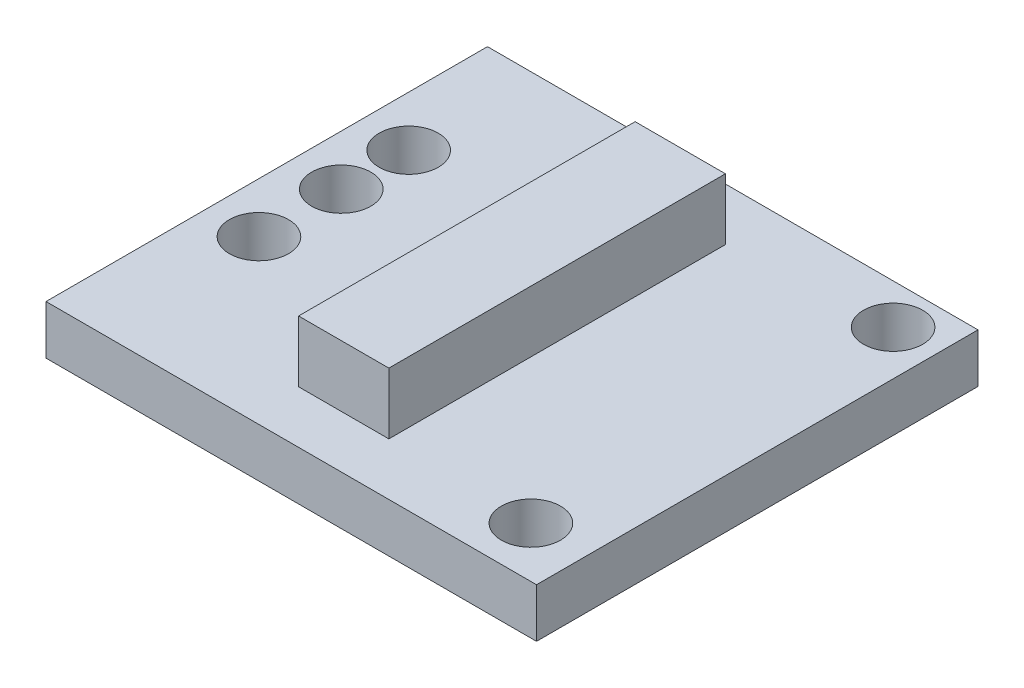
ISO-10303-21;
HEADER;
FILE_DESCRIPTION(('STEP AP214'),'2;1');
FILE_NAME('part.step','',(''),(''),'','','');
FILE_SCHEMA(('AUTOMOTIVE_DESIGN { 1 0 10303 214 1 1 1 1 }'));
ENDSEC;
DATA;
#1=APPLICATION_CONTEXT('core data for automotive mechanical design processes');
#2=APPLICATION_PROTOCOL_DEFINITION('international standard','automotive_design',2000,#1);
#3=PRODUCT_CONTEXT('',#1,'mechanical');
#4=PRODUCT('Part','Part','',(#3));
#5=PRODUCT_RELATED_PRODUCT_CATEGORY('part','',(#4));
#6=PRODUCT_DEFINITION_FORMATION('','',#4);
#7=PRODUCT_DEFINITION_CONTEXT('part definition',#1,'design');
#8=PRODUCT_DEFINITION('design','',#6,#7);
#9=PRODUCT_DEFINITION_SHAPE('','',#8);
#10=(LENGTH_UNIT() NAMED_UNIT(*) SI_UNIT(.MILLI.,.METRE.));
#11=(NAMED_UNIT(*) PLANE_ANGLE_UNIT() SI_UNIT($,.RADIAN.));
#12=(NAMED_UNIT(*) SI_UNIT($,.STERADIAN.) SOLID_ANGLE_UNIT());
#13=UNCERTAINTY_MEASURE_WITH_UNIT(LENGTH_MEASURE(1.E-05),#10,'distance_accuracy_value','');
#14=(GEOMETRIC_REPRESENTATION_CONTEXT(3) GLOBAL_UNCERTAINTY_ASSIGNED_CONTEXT((#13)) GLOBAL_UNIT_ASSIGNED_CONTEXT((#10,
#11,#12)) REPRESENTATION_CONTEXT('',''));
#15=CARTESIAN_POINT('',(0.,0.,0.));
#16=DIRECTION('',(0.,0.,1.));
#17=DIRECTION('',(1.,0.,0.));
#18=AXIS2_PLACEMENT_3D('',#15,#16,#17);
#19=CARTESIAN_POINT('',(0.,1.,0.));
#20=DIRECTION('',(0.,1.,0.));
#21=DIRECTION('',(0.,0.,1.));
#22=AXIS2_PLACEMENT_3D('',#19,#20,#21);
#23=PLANE('',#22);
#24=CARTESIAN_POINT('',(4.08905372006273,1.,-3.68014834805646));
#25=DIRECTION('',(0.,1.,0.));
#26=DIRECTION('',(0.,0.,1.));
#27=AXIS2_PLACEMENT_3D('',#24,#25,#26);
#28=CIRCLE('',#27,0.603114575476821);
#29=CARTESIAN_POINT('',(4.08905372006273,1.,-3.07703377257964));
#30=VERTEX_POINT('',#29);
#31=EDGE_CURVE('E162',#30,#30,#28,.T.);
#32=ORIENTED_EDGE('',*,*,#31,.F.);
#33=EDGE_LOOP('',(#32));
#34=FACE_BOUND('',#33,.T.);
#35=CARTESIAN_POINT('',(-3.97449173088398,1.,-0.493456274501652));
#36=DIRECTION('',(0.,1.,0.));
#37=DIRECTION('',(0.,0.,1.));
#38=AXIS2_PLACEMENT_3D('',#35,#36,#37);
#39=CIRCLE('',#38,0.603114575476821);
#40=CARTESIAN_POINT('',(-3.97449173088398,1.,0.109658300975169));
#41=VERTEX_POINT('',#40);
#42=EDGE_CURVE('E178',#41,#41,#39,.T.);
#43=ORIENTED_EDGE('',*,*,#42,.F.);
#44=EDGE_LOOP('',(#43));
#45=FACE_BOUND('',#44,.T.);
#46=DIRECTION('',(0.,0.,1.));
#47=VECTOR('',#46,1.);
#48=CARTESIAN_POINT('',(-5.,1.,4.5));
#49=LINE('',#48,#47);
#50=CARTESIAN_POINT('',(-5.,1.,-4.5));
#51=VERTEX_POINT('',#50);
#52=CARTESIAN_POINT('',(-5.,1.,4.5));
#53=VERTEX_POINT('',#52);
#54=EDGE_CURVE('E194',#51,#53,#49,.T.);
#55=ORIENTED_EDGE('',*,*,#54,.T.);
#56=DIRECTION('',(1.,0.,0.));
#57=VECTOR('',#56,1.);
#58=CARTESIAN_POINT('',(5.,1.,4.5));
#59=LINE('',#58,#57);
#60=CARTESIAN_POINT('',(5.,1.,4.5));
#61=VERTEX_POINT('',#60);
#62=EDGE_CURVE('E98',#53,#61,#59,.T.);
#63=ORIENTED_EDGE('',*,*,#62,.T.);
#64=DIRECTION('',(0.,0.,-1.));
#65=VECTOR('',#64,1.);
#66=CARTESIAN_POINT('',(5.,1.,4.5));
#67=LINE('',#66,#65);
#68=CARTESIAN_POINT('',(5.,1.,-4.5));
#69=VERTEX_POINT('',#68);
#70=EDGE_CURVE('E199',#61,#69,#67,.T.);
#71=ORIENTED_EDGE('',*,*,#70,.T.);
#72=DIRECTION('',(-1.,0.,0.));
#73=VECTOR('',#72,1.);
#74=CARTESIAN_POINT('',(5.,1.,-4.5));
#75=LINE('',#74,#73);
#76=EDGE_CURVE('E70',#69,#51,#75,.T.);
#77=ORIENTED_EDGE('',*,*,#76,.T.);
#78=EDGE_LOOP('',(#55,#63,#71,#77));
#79=FACE_BOUND('',#78,.T.);
#80=CARTESIAN_POINT('',(-3.97449173088398,1.,1.18402283745705));
#81=DIRECTION('',(0.,1.,0.));
#82=DIRECTION('',(0.,0.,1.));
#83=AXIS2_PLACEMENT_3D('',#80,#81,#82);
#84=CIRCLE('',#83,0.603114575476821);
#85=CARTESIAN_POINT('',(-3.97449173088398,1.,1.78713741293387));
#86=VERTEX_POINT('',#85);
#87=EDGE_CURVE('E186',#86,#86,#84,.T.);
#88=ORIENTED_EDGE('',*,*,#87,.F.);
#89=EDGE_LOOP('',(#88));
#90=FACE_BOUND('',#89,.T.);
#91=CARTESIAN_POINT('',(-3.97449173088398,1.,-1.86843915315632));
#92=DIRECTION('',(0.,1.,0.));
#93=DIRECTION('',(0.,0.,1.));
#94=AXIS2_PLACEMENT_3D('',#91,#92,#93);
#95=CIRCLE('',#94,0.603114575476821);
#96=CARTESIAN_POINT('',(-3.97449173088398,1.,-1.2653245776795));
#97=VERTEX_POINT('',#96);
#98=EDGE_CURVE('E170',#97,#97,#95,.T.);
#99=ORIENTED_EDGE('',*,*,#98,.F.);
#100=EDGE_LOOP('',(#99));
#101=FACE_BOUND('',#100,.T.);
#102=CARTESIAN_POINT('',(3.85534600629377,1.,3.46981140566439));
#103=DIRECTION('',(0.,1.,0.));
#104=DIRECTION('',(0.,0.,1.));
#105=AXIS2_PLACEMENT_3D('',#102,#103,#104);
#106=CIRCLE('',#105,0.603114575476821);
#107=CARTESIAN_POINT('',(3.85534600629377,1.,4.07292598114121));
#108=VERTEX_POINT('',#107);
#109=EDGE_CURVE('E153',#108,#108,#106,.T.);
#110=ORIENTED_EDGE('',*,*,#109,.F.);
#111=EDGE_LOOP('',(#110));
#112=FACE_BOUND('',#111,.T.);
#113=DIRECTION('',(1.,0.,0.));
#114=VECTOR('',#113,1.);
#115=CARTESIAN_POINT('',(0.92015493091809,1.,3.4305776228794));
#116=LINE('',#115,#114);
#117=CARTESIAN_POINT('',(-0.92015493091809,1.,3.4305776228794));
#118=VERTEX_POINT('',#117);
#119=CARTESIAN_POINT('',(0.92015493091809,1.,3.4305776228794));
#120=VERTEX_POINT('',#119);
#121=EDGE_CURVE('E419',#118,#120,#116,.T.);
#122=ORIENTED_EDGE('',*,*,#121,.F.);
#123=DIRECTION('',(0.,0.,1.));
#124=VECTOR('',#123,1.);
#125=CARTESIAN_POINT('',(-0.92015493091809,1.,3.4305776228794));
#126=LINE('',#125,#124);
#127=CARTESIAN_POINT('',(-0.92015493091809,1.,-3.4305776228794));
#128=VERTEX_POINT('',#127);
#129=EDGE_CURVE('E145',#128,#118,#126,.T.);
#130=ORIENTED_EDGE('',*,*,#129,.F.);
#131=DIRECTION('',(-1.,0.,0.));
#132=VECTOR('',#131,1.);
#133=CARTESIAN_POINT('',(0.92015493091809,1.,-3.4305776228794));
#134=LINE('',#133,#132);
#135=CARTESIAN_POINT('',(0.92015493091809,1.,-3.4305776228794));
#136=VERTEX_POINT('',#135);
#137=EDGE_CURVE('E141',#136,#128,#134,.T.);
#138=ORIENTED_EDGE('',*,*,#137,.F.);
#139=DIRECTION('',(0.,0.,-1.));
#140=VECTOR('',#139,1.);
#141=CARTESIAN_POINT('',(0.92015493091809,1.,3.4305776228794));
#142=LINE('',#141,#140);
#143=EDGE_CURVE('E415',#120,#136,#142,.T.);
#144=ORIENTED_EDGE('',*,*,#143,.F.);
#145=EDGE_LOOP('',(#122,#130,#138,#144));
#146=FACE_BOUND('',#145,.T.);
#147=ADVANCED_FACE('F45',(#34,#45,#79,#90,#101,#112,#146),#23,.T.);
#148=CARTESIAN_POINT('',(0.,0.,0.));
#149=DIRECTION('',(0.,1.,0.));
#150=DIRECTION('',(0.,0.,1.));
#151=AXIS2_PLACEMENT_3D('',#148,#149,#150);
#152=PLANE('',#151);
#153=DIRECTION('',(0.,0.,1.));
#154=VECTOR('',#153,1.);
#155=CARTESIAN_POINT('',(-5.,0.,4.5));
#156=LINE('',#155,#154);
#157=CARTESIAN_POINT('',(-5.,0.,-4.5));
#158=VERTEX_POINT('',#157);
#159=CARTESIAN_POINT('',(-5.,0.,4.5));
#160=VERTEX_POINT('',#159);
#161=EDGE_CURVE('E190',#158,#160,#156,.T.);
#162=ORIENTED_EDGE('',*,*,#161,.F.);
#163=DIRECTION('',(-1.,0.,0.));
#164=VECTOR('',#163,1.);
#165=CARTESIAN_POINT('',(5.,0.,-4.5));
#166=LINE('',#165,#164);
#167=CARTESIAN_POINT('',(5.,0.,-4.5));
#168=VERTEX_POINT('',#167);
#169=EDGE_CURVE('E91',#168,#158,#166,.T.);
#170=ORIENTED_EDGE('',*,*,#169,.F.);
#171=DIRECTION('',(0.,0.,-1.));
#172=VECTOR('',#171,1.);
#173=CARTESIAN_POINT('',(5.,0.,4.5));
#174=LINE('',#173,#172);
#175=CARTESIAN_POINT('',(5.,0.,4.5));
#176=VERTEX_POINT('',#175);
#177=EDGE_CURVE('E211',#176,#168,#174,.T.);
#178=ORIENTED_EDGE('',*,*,#177,.F.);
#179=DIRECTION('',(1.,0.,0.));
#180=VECTOR('',#179,1.);
#181=CARTESIAN_POINT('',(5.,0.,4.5));
#182=LINE('',#181,#180);
#183=EDGE_CURVE('E208',#160,#176,#182,.T.);
#184=ORIENTED_EDGE('',*,*,#183,.F.);
#185=EDGE_LOOP('',(#162,#170,#178,#184));
#186=FACE_BOUND('',#185,.T.);
#187=CARTESIAN_POINT('',(-3.97449173088398,0.,1.18402283745705));
#188=DIRECTION('',(0.,1.,0.));
#189=DIRECTION('',(0.,0.,1.));
#190=AXIS2_PLACEMENT_3D('',#187,#188,#189);
#191=CIRCLE('',#190,0.603114575476821);
#192=CARTESIAN_POINT('',(-3.97449173088398,0.,1.78713741293387));
#193=VERTEX_POINT('',#192);
#194=EDGE_CURVE('E182',#193,#193,#191,.T.);
#195=ORIENTED_EDGE('',*,*,#194,.T.);
#196=EDGE_LOOP('',(#195));
#197=FACE_BOUND('',#196,.T.);
#198=CARTESIAN_POINT('',(-3.97449173088398,0.,-0.493456274501652));
#199=DIRECTION('',(0.,1.,0.));
#200=DIRECTION('',(0.,0.,1.));
#201=AXIS2_PLACEMENT_3D('',#198,#199,#200);
#202=CIRCLE('',#201,0.603114575476821);
#203=CARTESIAN_POINT('',(-3.97449173088398,0.,0.109658300975169));
#204=VERTEX_POINT('',#203);
#205=EDGE_CURVE('E174',#204,#204,#202,.T.);
#206=ORIENTED_EDGE('',*,*,#205,.T.);
#207=EDGE_LOOP('',(#206));
#208=FACE_BOUND('',#207,.T.);
#209=CARTESIAN_POINT('',(-3.97449173088398,0.,-1.86843915315632));
#210=DIRECTION('',(0.,1.,0.));
#211=DIRECTION('',(0.,0.,1.));
#212=AXIS2_PLACEMENT_3D('',#209,#210,#211);
#213=CIRCLE('',#212,0.603114575476821);
#214=CARTESIAN_POINT('',(-3.97449173088398,0.,-1.2653245776795));
#215=VERTEX_POINT('',#214);
#216=EDGE_CURVE('E166',#215,#215,#213,.T.);
#217=ORIENTED_EDGE('',*,*,#216,.T.);
#218=EDGE_LOOP('',(#217));
#219=FACE_BOUND('',#218,.T.);
#220=CARTESIAN_POINT('',(4.08905372006273,0.,-3.68014834805646));
#221=DIRECTION('',(0.,1.,0.));
#222=DIRECTION('',(0.,0.,1.));
#223=AXIS2_PLACEMENT_3D('',#220,#221,#222);
#224=CIRCLE('',#223,0.603114575476821);
#225=CARTESIAN_POINT('',(4.08905372006273,0.,-3.07703377257964));
#226=VERTEX_POINT('',#225);
#227=EDGE_CURVE('E160',#226,#226,#224,.T.);
#228=ORIENTED_EDGE('',*,*,#227,.T.);
#229=EDGE_LOOP('',(#228));
#230=FACE_BOUND('',#229,.T.);
#231=CARTESIAN_POINT('',(3.85534600629377,0.,3.46981140566439));
#232=DIRECTION('',(0.,1.,0.));
#233=DIRECTION('',(0.,0.,1.));
#234=AXIS2_PLACEMENT_3D('',#231,#232,#233);
#235=CIRCLE('',#234,0.603114575476821);
#236=CARTESIAN_POINT('',(3.85534600629377,0.,4.07292598114121));
#237=VERTEX_POINT('',#236);
#238=EDGE_CURVE('E148',#237,#237,#235,.T.);
#239=ORIENTED_EDGE('',*,*,#238,.T.);
#240=EDGE_LOOP('',(#239));
#241=FACE_BOUND('',#240,.T.);
#242=ADVANCED_FACE('F229',(#186,#197,#208,#219,#230,#241),#152,.F.);
#243=CARTESIAN_POINT('',(-5.,1.,4.5));
#244=DIRECTION('',(1.,0.,0.));
#245=DIRECTION('',(0.,0.,-1.));
#246=AXIS2_PLACEMENT_3D('',#243,#244,#245);
#247=PLANE('',#246);
#248=ORIENTED_EDGE('',*,*,#161,.T.);
#249=DIRECTION('',(0.,-1.,0.));
#250=VECTOR('',#249,1.);
#251=CARTESIAN_POINT('',(-5.,1.,4.5));
#252=LINE('',#251,#250);
#253=EDGE_CURVE('E11',#53,#160,#252,.T.);
#254=ORIENTED_EDGE('',*,*,#253,.F.);
#255=ORIENTED_EDGE('',*,*,#54,.F.);
#256=DIRECTION('',(0.,-1.,0.));
#257=VECTOR('',#256,1.);
#258=CARTESIAN_POINT('',(-5.,1.,-4.5));
#259=LINE('',#258,#257);
#260=EDGE_CURVE('E204',#51,#158,#259,.T.);
#261=ORIENTED_EDGE('',*,*,#260,.T.);
#262=EDGE_LOOP('',(#248,#254,#255,#261));
#263=FACE_BOUND('',#262,.T.);
#264=ADVANCED_FACE('F47',(#263),#247,.F.);
#265=CARTESIAN_POINT('',(5.,1.,4.5));
#266=DIRECTION('',(0.,0.,-1.));
#267=DIRECTION('',(-1.,0.,0.));
#268=AXIS2_PLACEMENT_3D('',#265,#266,#267);
#269=PLANE('',#268);
#270=ORIENTED_EDGE('',*,*,#183,.T.);
#271=DIRECTION('',(0.,-1.,0.));
#272=VECTOR('',#271,1.);
#273=CARTESIAN_POINT('',(5.,1.,4.5));
#274=LINE('',#273,#272);
#275=EDGE_CURVE('E54',#61,#176,#274,.T.);
#276=ORIENTED_EDGE('',*,*,#275,.F.);
#277=ORIENTED_EDGE('',*,*,#62,.F.);
#278=ORIENTED_EDGE('',*,*,#253,.T.);
#279=EDGE_LOOP('',(#270,#276,#277,#278));
#280=FACE_BOUND('',#279,.T.);
#281=ADVANCED_FACE('F245',(#280),#269,.F.);
#282=CARTESIAN_POINT('',(5.,1.,4.5));
#283=DIRECTION('',(-1.,0.,0.));
#284=DIRECTION('',(0.,0.,1.));
#285=AXIS2_PLACEMENT_3D('',#282,#283,#284);
#286=PLANE('',#285);
#287=ORIENTED_EDGE('',*,*,#177,.T.);
#288=DIRECTION('',(0.,-1.,0.));
#289=VECTOR('',#288,1.);
#290=CARTESIAN_POINT('',(5.,1.,-4.5));
#291=LINE('',#290,#289);
#292=EDGE_CURVE('E218',#69,#168,#291,.T.);
#293=ORIENTED_EDGE('',*,*,#292,.F.);
#294=ORIENTED_EDGE('',*,*,#70,.F.);
#295=ORIENTED_EDGE('',*,*,#275,.T.);
#296=EDGE_LOOP('',(#287,#293,#294,#295));
#297=FACE_BOUND('',#296,.T.);
#298=ADVANCED_FACE('F225',(#297),#286,.F.);
#299=CARTESIAN_POINT('',(5.,1.,-4.5));
#300=DIRECTION('',(0.,0.,1.));
#301=DIRECTION('',(1.,0.,0.));
#302=AXIS2_PLACEMENT_3D('',#299,#300,#301);
#303=PLANE('',#302);
#304=ORIENTED_EDGE('',*,*,#169,.T.);
#305=ORIENTED_EDGE('',*,*,#260,.F.);
#306=ORIENTED_EDGE('',*,*,#76,.F.);
#307=ORIENTED_EDGE('',*,*,#292,.T.);
#308=EDGE_LOOP('',(#304,#305,#306,#307));
#309=FACE_BOUND('',#308,.T.);
#310=ADVANCED_FACE('F234',(#309),#303,.F.);
#311=CARTESIAN_POINT('',(-3.97449173088398,1.,1.18402283745705));
#312=DIRECTION('',(0.,-1.,0.));
#313=DIRECTION('',(0.,0.,-1.));
#314=AXIS2_PLACEMENT_3D('',#311,#312,#313);
#315=CYLINDRICAL_SURFACE('',#314,0.603114575476821);
#316=ORIENTED_EDGE('',*,*,#87,.T.);
#317=EDGE_LOOP('',(#316));
#318=FACE_BOUND('',#317,.T.);
#319=ORIENTED_EDGE('',*,*,#194,.F.);
#320=EDGE_LOOP('',(#319));
#321=FACE_BOUND('',#320,.T.);
#322=ADVANCED_FACE('F236',(#318,#321),#315,.F.);
#323=CARTESIAN_POINT('',(-3.97449173088398,1.,-0.493456274501652));
#324=DIRECTION('',(0.,-1.,0.));
#325=DIRECTION('',(0.,0.,-1.));
#326=AXIS2_PLACEMENT_3D('',#323,#324,#325);
#327=CYLINDRICAL_SURFACE('',#326,0.603114575476821);
#328=ORIENTED_EDGE('',*,*,#42,.T.);
#329=EDGE_LOOP('',(#328));
#330=FACE_BOUND('',#329,.T.);
#331=ORIENTED_EDGE('',*,*,#205,.F.);
#332=EDGE_LOOP('',(#331));
#333=FACE_BOUND('',#332,.T.);
#334=ADVANCED_FACE('F242',(#330,#333),#327,.F.);
#335=CARTESIAN_POINT('',(-3.97449173088398,1.,-1.86843915315632));
#336=DIRECTION('',(0.,-1.,0.));
#337=DIRECTION('',(0.,0.,-1.));
#338=AXIS2_PLACEMENT_3D('',#335,#336,#337);
#339=CYLINDRICAL_SURFACE('',#338,0.603114575476821);
#340=ORIENTED_EDGE('',*,*,#98,.T.);
#341=EDGE_LOOP('',(#340));
#342=FACE_BOUND('',#341,.T.);
#343=ORIENTED_EDGE('',*,*,#216,.F.);
#344=EDGE_LOOP('',(#343));
#345=FACE_BOUND('',#344,.T.);
#346=ADVANCED_FACE('F259',(#342,#345),#339,.F.);
#347=CARTESIAN_POINT('',(4.08905372006273,1.,-3.68014834805646));
#348=DIRECTION('',(0.,-1.,0.));
#349=DIRECTION('',(0.,0.,-1.));
#350=AXIS2_PLACEMENT_3D('',#347,#348,#349);
#351=CYLINDRICAL_SURFACE('',#350,0.603114575476821);
#352=ORIENTED_EDGE('',*,*,#31,.T.);
#353=EDGE_LOOP('',(#352));
#354=FACE_BOUND('',#353,.T.);
#355=ORIENTED_EDGE('',*,*,#227,.F.);
#356=EDGE_LOOP('',(#355));
#357=FACE_BOUND('',#356,.T.);
#358=ADVANCED_FACE('F263',(#354,#357),#351,.F.);
#359=CARTESIAN_POINT('',(3.85534600629377,1.,3.46981140566439));
#360=DIRECTION('',(0.,-1.,0.));
#361=DIRECTION('',(0.,0.,-1.));
#362=AXIS2_PLACEMENT_3D('',#359,#360,#361);
#363=CYLINDRICAL_SURFACE('',#362,0.603114575476821);
#364=ORIENTED_EDGE('',*,*,#109,.T.);
#365=EDGE_LOOP('',(#364));
#366=FACE_BOUND('',#365,.T.);
#367=ORIENTED_EDGE('',*,*,#238,.F.);
#368=EDGE_LOOP('',(#367));
#369=FACE_BOUND('',#368,.T.);
#370=ADVANCED_FACE('F267',(#366,#369),#363,.F.);
#371=CARTESIAN_POINT('',(-0.92015493091809,2.25,3.4305776228794));
#372=DIRECTION('',(1.,0.,0.));
#373=DIRECTION('',(0.,0.,-1.));
#374=AXIS2_PLACEMENT_3D('',#371,#372,#373);
#375=PLANE('',#374);
#376=ORIENTED_EDGE('',*,*,#129,.T.);
#377=DIRECTION('',(0.,-1.,0.));
#378=VECTOR('',#377,1.);
#379=CARTESIAN_POINT('',(-0.92015493091809,2.25,3.4305776228794));
#380=LINE('',#379,#378);
#381=CARTESIAN_POINT('',(-0.92015493091809,2.25,3.4305776228794));
#382=VERTEX_POINT('',#381);
#383=EDGE_CURVE('E124',#382,#118,#380,.T.);
#384=ORIENTED_EDGE('',*,*,#383,.F.);
#385=DIRECTION('',(0.,0.,1.));
#386=VECTOR('',#385,1.);
#387=CARTESIAN_POINT('',(-0.92015493091809,2.25,3.4305776228794));
#388=LINE('',#387,#386);
#389=CARTESIAN_POINT('',(-0.92015493091809,2.25,-3.4305776228794));
#390=VERTEX_POINT('',#389);
#391=EDGE_CURVE('E132',#390,#382,#388,.T.);
#392=ORIENTED_EDGE('',*,*,#391,.F.);
#393=DIRECTION('',(0.,-1.,0.));
#394=VECTOR('',#393,1.);
#395=CARTESIAN_POINT('',(-0.92015493091809,2.25,-3.4305776228794));
#396=LINE('',#395,#394);
#397=EDGE_CURVE('E411',#390,#128,#396,.T.);
#398=ORIENTED_EDGE('',*,*,#397,.T.);
#399=EDGE_LOOP('',(#376,#384,#392,#398));
#400=FACE_BOUND('',#399,.T.);
#401=ADVANCED_FACE('F143',(#400),#375,.F.);
#402=CARTESIAN_POINT('',(0.92015493091809,2.25,3.4305776228794));
#403=DIRECTION('',(0.,0.,-1.));
#404=DIRECTION('',(-1.,0.,0.));
#405=AXIS2_PLACEMENT_3D('',#402,#403,#404);
#406=PLANE('',#405);
#407=ORIENTED_EDGE('',*,*,#121,.T.);
#408=DIRECTION('',(0.,-1.,0.));
#409=VECTOR('',#408,1.);
#410=CARTESIAN_POINT('',(0.92015493091809,2.25,3.4305776228794));
#411=LINE('',#410,#409);
#412=CARTESIAN_POINT('',(0.92015493091809,2.25,3.4305776228794));
#413=VERTEX_POINT('',#412);
#414=EDGE_CURVE('E127',#413,#120,#411,.T.);
#415=ORIENTED_EDGE('',*,*,#414,.F.);
#416=DIRECTION('',(1.,0.,0.));
#417=VECTOR('',#416,1.);
#418=CARTESIAN_POINT('',(0.92015493091809,2.25,3.4305776228794));
#419=LINE('',#418,#417);
#420=EDGE_CURVE('E120',#382,#413,#419,.T.);
#421=ORIENTED_EDGE('',*,*,#420,.F.);
#422=ORIENTED_EDGE('',*,*,#383,.T.);
#423=EDGE_LOOP('',(#407,#415,#421,#422));
#424=FACE_BOUND('',#423,.T.);
#425=ADVANCED_FACE('F122',(#424),#406,.F.);
#426=CARTESIAN_POINT('',(0.92015493091809,2.25,3.4305776228794));
#427=DIRECTION('',(-1.,0.,0.));
#428=DIRECTION('',(0.,0.,1.));
#429=AXIS2_PLACEMENT_3D('',#426,#427,#428);
#430=PLANE('',#429);
#431=ORIENTED_EDGE('',*,*,#143,.T.);
#432=DIRECTION('',(0.,-1.,0.));
#433=VECTOR('',#432,1.);
#434=CARTESIAN_POINT('',(0.92015493091809,2.25,-3.4305776228794));
#435=LINE('',#434,#433);
#436=CARTESIAN_POINT('',(0.92015493091809,2.25,-3.4305776228794));
#437=VERTEX_POINT('',#436);
#438=EDGE_CURVE('E61',#437,#136,#435,.T.);
#439=ORIENTED_EDGE('',*,*,#438,.F.);
#440=DIRECTION('',(0.,0.,-1.));
#441=VECTOR('',#440,1.);
#442=CARTESIAN_POINT('',(0.92015493091809,2.25,3.4305776228794));
#443=LINE('',#442,#441);
#444=EDGE_CURVE('E131',#413,#437,#443,.T.);
#445=ORIENTED_EDGE('',*,*,#444,.F.);
#446=ORIENTED_EDGE('',*,*,#414,.T.);
#447=EDGE_LOOP('',(#431,#439,#445,#446));
#448=FACE_BOUND('',#447,.T.);
#449=ADVANCED_FACE('F276',(#448),#430,.F.);
#450=CARTESIAN_POINT('',(0.92015493091809,2.25,-3.4305776228794));
#451=DIRECTION('',(0.,0.,1.));
#452=DIRECTION('',(1.,0.,0.));
#453=AXIS2_PLACEMENT_3D('',#450,#451,#452);
#454=PLANE('',#453);
#455=ORIENTED_EDGE('',*,*,#137,.T.);
#456=ORIENTED_EDGE('',*,*,#397,.F.);
#457=DIRECTION('',(-1.,0.,0.));
#458=VECTOR('',#457,1.);
#459=CARTESIAN_POINT('',(0.92015493091809,2.25,-3.4305776228794));
#460=LINE('',#459,#458);
#461=EDGE_CURVE('E136',#437,#390,#460,.T.);
#462=ORIENTED_EDGE('',*,*,#461,.F.);
#463=ORIENTED_EDGE('',*,*,#438,.T.);
#464=EDGE_LOOP('',(#455,#456,#462,#463));
#465=FACE_BOUND('',#464,.T.);
#466=ADVANCED_FACE('F279',(#465),#454,.F.);
#467=CARTESIAN_POINT('',(0.,2.25,0.));
#468=DIRECTION('',(0.,1.,0.));
#469=DIRECTION('',(0.,0.,1.));
#470=AXIS2_PLACEMENT_3D('',#467,#468,#469);
#471=PLANE('',#470);
#472=ORIENTED_EDGE('',*,*,#391,.T.);
#473=ORIENTED_EDGE('',*,*,#420,.T.);
#474=ORIENTED_EDGE('',*,*,#444,.T.);
#475=ORIENTED_EDGE('',*,*,#461,.T.);
#476=EDGE_LOOP('',(#472,#473,#474,#475));
#477=FACE_BOUND('',#476,.T.);
#478=ADVANCED_FACE('F135',(#477),#471,.T.);
#479=CLOSED_SHELL('',(#147,#242,#264,#281,#298,#310,#322,#334,#346,#358,#370,#401,#425,#449,
#466,#478));
#480=MANIFOLD_SOLID_BREP('B2',#479);
#481=ADVANCED_BREP_SHAPE_REPRESENTATION('',(#18,#480),#14);
#482=SHAPE_DEFINITION_REPRESENTATION(#9,#481);
ENDSEC;
END-ISO-10303-21;
